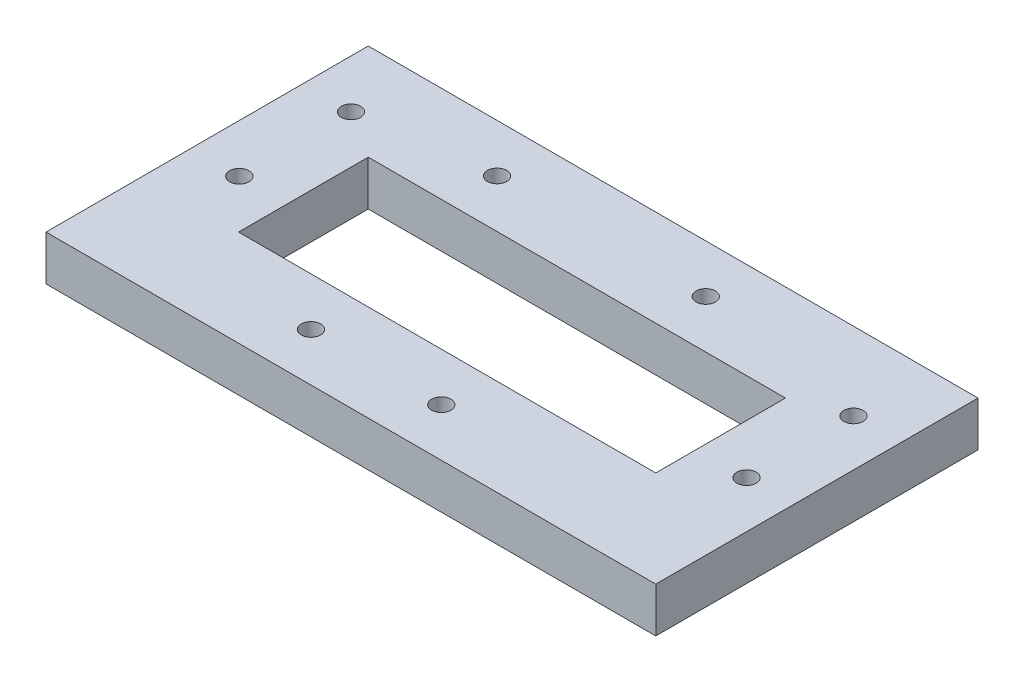
ISO-10303-21;
HEADER;
FILE_DESCRIPTION(('STEP AP214'),'2;1');
FILE_NAME('part.step','',(''),(''),'','','');
FILE_SCHEMA(('AUTOMOTIVE_DESIGN { 1 0 10303 214 1 1 1 1 }'));
ENDSEC;
DATA;
#1=APPLICATION_CONTEXT('core data for automotive mechanical design processes');
#2=APPLICATION_PROTOCOL_DEFINITION('international standard','automotive_design',2000,#1);
#3=PRODUCT_CONTEXT('',#1,'mechanical');
#4=PRODUCT('Part','Part','',(#3));
#5=PRODUCT_RELATED_PRODUCT_CATEGORY('part','',(#4));
#6=PRODUCT_DEFINITION_FORMATION('','',#4);
#7=PRODUCT_DEFINITION_CONTEXT('part definition',#1,'design');
#8=PRODUCT_DEFINITION('design','',#6,#7);
#9=PRODUCT_DEFINITION_SHAPE('','',#8);
#10=(LENGTH_UNIT() NAMED_UNIT(*) SI_UNIT(.MILLI.,.METRE.));
#11=(NAMED_UNIT(*) PLANE_ANGLE_UNIT() SI_UNIT($,.RADIAN.));
#12=(NAMED_UNIT(*) SI_UNIT($,.STERADIAN.) SOLID_ANGLE_UNIT());
#13=UNCERTAINTY_MEASURE_WITH_UNIT(LENGTH_MEASURE(1.E-05),#10,'distance_accuracy_value','');
#14=(GEOMETRIC_REPRESENTATION_CONTEXT(3) GLOBAL_UNCERTAINTY_ASSIGNED_CONTEXT((#13)) GLOBAL_UNIT_ASSIGNED_CONTEXT((#10,
#11,#12)) REPRESENTATION_CONTEXT('',''));
#15=CARTESIAN_POINT('',(0.,0.,0.));
#16=DIRECTION('',(0.,0.,1.));
#17=DIRECTION('',(1.,0.,0.));
#18=AXIS2_PLACEMENT_3D('',#15,#16,#17);
#19=CARTESIAN_POINT('',(0.,6.99999999999999,0.));
#20=DIRECTION('',(0.,-1.,0.));
#21=DIRECTION('',(0.,0.,-1.));
#22=AXIS2_PLACEMENT_3D('',#19,#20,#21);
#23=PLANE('',#22);
#24=DIRECTION('',(0.,0.,-1.));
#25=VECTOR('',#24,1.);
#26=CARTESIAN_POINT('',(47.499999996,6.99999999999999,25.10249996));
#27=LINE('',#26,#25);
#28=CARTESIAN_POINT('',(47.499999996,6.99999999999999,25.10249996));
#29=VERTEX_POINT('',#28);
#30=CARTESIAN_POINT('',(47.499999996,6.99999999999999,-25.10249996));
#31=VERTEX_POINT('',#30);
#32=EDGE_CURVE('E137',#29,#31,#27,.T.);
#33=ORIENTED_EDGE('',*,*,#32,.T.);
#34=DIRECTION('',(-1.,0.,0.));
#35=VECTOR('',#34,1.);
#36=CARTESIAN_POINT('',(-47.499999996,6.99999999999999,-25.10249996));
#37=LINE('',#36,#35);
#38=CARTESIAN_POINT('',(-47.499999996,6.99999999999999,-25.10249996));
#39=VERTEX_POINT('',#38);
#40=EDGE_CURVE('E140',#31,#39,#37,.T.);
#41=ORIENTED_EDGE('',*,*,#40,.T.);
#42=DIRECTION('',(0.,0.,1.));
#43=VECTOR('',#42,1.);
#44=CARTESIAN_POINT('',(-47.499999996,6.99999999999999,25.10249996));
#45=LINE('',#44,#43);
#46=CARTESIAN_POINT('',(-47.499999996,6.99999999999999,25.10249996));
#47=VERTEX_POINT('',#46);
#48=EDGE_CURVE('E143',#39,#47,#45,.T.);
#49=ORIENTED_EDGE('',*,*,#48,.T.);
#50=DIRECTION('',(1.,0.,0.));
#51=VECTOR('',#50,1.);
#52=CARTESIAN_POINT('',(-47.499999996,6.99999999999999,25.10249996));
#53=LINE('',#52,#51);
#54=EDGE_CURVE('E145',#47,#29,#53,.T.);
#55=ORIENTED_EDGE('',*,*,#54,.T.);
#56=EDGE_LOOP('',(#33,#41,#49,#55));
#57=FACE_BOUND('',#56,.T.);
#58=DIRECTION('',(0.,0.,-1.));
#59=VECTOR('',#58,1.);
#60=CARTESIAN_POINT('',(32.499999996,6.99999999999999,10.10249996));
#61=LINE('',#60,#59);
#62=CARTESIAN_POINT('',(32.499999996,6.99999999999999,10.10249996));
#63=VERTEX_POINT('',#62);
#64=CARTESIAN_POINT('',(32.499999996,6.99999999999999,-10.10249996));
#65=VERTEX_POINT('',#64);
#66=EDGE_CURVE('E98',#63,#65,#61,.T.);
#67=ORIENTED_EDGE('',*,*,#66,.F.);
#68=DIRECTION('',(1.,0.,0.));
#69=VECTOR('',#68,1.);
#70=CARTESIAN_POINT('',(-32.499999996,6.99999999999999,10.10249996));
#71=LINE('',#70,#69);
#72=CARTESIAN_POINT('',(-32.499999996,6.99999999999999,10.10249996));
#73=VERTEX_POINT('',#72);
#74=EDGE_CURVE('E121',#73,#63,#71,.T.);
#75=ORIENTED_EDGE('',*,*,#74,.F.);
#76=DIRECTION('',(0.,0.,1.));
#77=VECTOR('',#76,1.);
#78=CARTESIAN_POINT('',(-32.499999996,6.99999999999999,10.10249996));
#79=LINE('',#78,#77);
#80=CARTESIAN_POINT('',(-32.499999996,6.99999999999999,-10.10249996));
#81=VERTEX_POINT('',#80);
#82=EDGE_CURVE('E119',#81,#73,#79,.T.);
#83=ORIENTED_EDGE('',*,*,#82,.F.);
#84=DIRECTION('',(-1.,0.,0.));
#85=VECTOR('',#84,1.);
#86=CARTESIAN_POINT('',(-32.499999996,6.99999999999999,-10.10249996));
#87=LINE('',#86,#85);
#88=EDGE_CURVE('E106',#65,#81,#87,.T.);
#89=ORIENTED_EDGE('',*,*,#88,.F.);
#90=EDGE_LOOP('',(#67,#75,#83,#89));
#91=FACE_BOUND('',#90,.T.);
#92=CARTESIAN_POINT('',(-19.93576272361,6.99999999999999,-17.60249996));
#93=DIRECTION('',(0.,1.,0.));
#94=DIRECTION('',(0.,0.,1.));
#95=AXIS2_PLACEMENT_3D('',#92,#93,#94);
#96=CIRCLE('',#95,1.5);
#97=CARTESIAN_POINT('',(-19.93576272361,6.99999999999999,-16.10249996));
#98=VERTEX_POINT('',#97);
#99=EDGE_CURVE('E127',#98,#98,#96,.T.);
#100=ORIENTED_EDGE('',*,*,#99,.F.);
#101=EDGE_LOOP('',(#100));
#102=FACE_BOUND('',#101,.T.);
#103=CARTESIAN_POINT('',(12.5845762275947,6.99999999999999,-17.60249996));
#104=DIRECTION('',(0.,1.,0.));
#105=DIRECTION('',(0.,0.,1.));
#106=AXIS2_PLACEMENT_3D('',#103,#104,#105);
#107=CIRCLE('',#106,1.5);
#108=CARTESIAN_POINT('',(12.5845762275947,6.99999999999999,-16.10249996));
#109=VERTEX_POINT('',#108);
#110=EDGE_CURVE('E289',#109,#109,#107,.T.);
#111=ORIENTED_EDGE('',*,*,#110,.F.);
#112=EDGE_LOOP('',(#111));
#113=FACE_BOUND('',#112,.T.);
#114=CARTESIAN_POINT('',(-39.9706488970292,6.99999999999999,-14.8779420764374));
#115=DIRECTION('',(0.,1.,0.));
#116=DIRECTION('',(0.,0.,1.));
#117=AXIS2_PLACEMENT_3D('',#114,#115,#116);
#118=CIRCLE('',#117,1.5);
#119=CARTESIAN_POINT('',(-39.9706488970292,6.99999999999999,-13.3779420764374));
#120=VERTEX_POINT('',#119);
#121=EDGE_CURVE('E283',#120,#120,#118,.T.);
#122=ORIENTED_EDGE('',*,*,#121,.F.);
#123=EDGE_LOOP('',(#122));
#124=FACE_BOUND('',#123,.T.);
#125=CARTESIAN_POINT('',(-39.9706488970292,6.99999999999999,2.51774473684552));
#126=DIRECTION('',(0.,1.,0.));
#127=DIRECTION('',(0.,0.,1.));
#128=AXIS2_PLACEMENT_3D('',#125,#126,#127);
#129=CIRCLE('',#128,1.5);
#130=CARTESIAN_POINT('',(-39.9706488970292,6.99999999999999,4.01774473684552));
#131=VERTEX_POINT('',#130);
#132=EDGE_CURVE('E277',#131,#131,#129,.T.);
#133=ORIENTED_EDGE('',*,*,#132,.F.);
#134=EDGE_LOOP('',(#133));
#135=FACE_BOUND('',#134,.T.);
#136=CARTESIAN_POINT('',(40.2074773716267,6.99999999999999,-12.9906741674492));
#137=DIRECTION('',(0.,1.,0.));
#138=DIRECTION('',(0.,0.,1.));
#139=AXIS2_PLACEMENT_3D('',#136,#137,#138);
#140=CIRCLE('',#139,1.5);
#141=CARTESIAN_POINT('',(40.2074773716267,6.99999999999999,-11.4906741674492));
#142=VERTEX_POINT('',#141);
#143=EDGE_CURVE('E271',#142,#142,#140,.T.);
#144=ORIENTED_EDGE('',*,*,#143,.F.);
#145=EDGE_LOOP('',(#144));
#146=FACE_BOUND('',#145,.T.);
#147=CARTESIAN_POINT('',(40.2074773716267,6.99999999999999,3.666516507534));
#148=DIRECTION('',(0.,1.,0.));
#149=DIRECTION('',(0.,0.,1.));
#150=AXIS2_PLACEMENT_3D('',#147,#148,#149);
#151=CIRCLE('',#150,1.5);
#152=CARTESIAN_POINT('',(40.2074773716267,6.99999999999999,5.16651650753401));
#153=VERTEX_POINT('',#152);
#154=EDGE_CURVE('E265',#153,#153,#151,.T.);
#155=ORIENTED_EDGE('',*,*,#154,.F.);
#156=EDGE_LOOP('',(#155));
#157=FACE_BOUND('',#156,.T.);
#158=CARTESIAN_POINT('',(-13.7160544382587,6.99999999999999,17.60249996));
#159=DIRECTION('',(0.,1.,0.));
#160=DIRECTION('',(0.,0.,1.));
#161=AXIS2_PLACEMENT_3D('',#158,#159,#160);
#162=CIRCLE('',#161,1.5);
#163=CARTESIAN_POINT('',(-13.7160544382587,6.99999999999999,19.10249996));
#164=VERTEX_POINT('',#163);
#165=EDGE_CURVE('E259',#164,#164,#162,.T.);
#166=ORIENTED_EDGE('',*,*,#165,.F.);
#167=EDGE_LOOP('',(#166));
#168=FACE_BOUND('',#167,.T.);
#169=CARTESIAN_POINT('',(6.58063012474729,6.99999999999999,17.60249996));
#170=DIRECTION('',(0.,1.,0.));
#171=DIRECTION('',(0.,0.,1.));
#172=AXIS2_PLACEMENT_3D('',#169,#170,#171);
#173=CIRCLE('',#172,1.5);
#174=CARTESIAN_POINT('',(6.58063012474729,6.99999999999999,19.10249996));
#175=VERTEX_POINT('',#174);
#176=EDGE_CURVE('E250',#175,#175,#173,.T.);
#177=ORIENTED_EDGE('',*,*,#176,.F.);
#178=EDGE_LOOP('',(#177));
#179=FACE_BOUND('',#178,.T.);
#180=ADVANCED_FACE('F33',(#57,#91,#102,#113,#124,#135,#146,#157,#168,#179),#23,.F.);
#181=CARTESIAN_POINT('',(0.,0.,0.));
#182=DIRECTION('',(0.,-1.,0.));
#183=DIRECTION('',(0.,0.,-1.));
#184=AXIS2_PLACEMENT_3D('',#181,#182,#183);
#185=PLANE('',#184);
#186=CARTESIAN_POINT('',(-13.7160544382587,0.,17.60249996));
#187=DIRECTION('',(0.,1.,0.));
#188=DIRECTION('',(0.,0.,1.));
#189=AXIS2_PLACEMENT_3D('',#186,#187,#188);
#190=CIRCLE('',#189,1.5);
#191=CARTESIAN_POINT('',(-13.7160544382587,0.,19.10249996));
#192=VERTEX_POINT('',#191);
#193=EDGE_CURVE('E256',#192,#192,#190,.T.);
#194=ORIENTED_EDGE('',*,*,#193,.T.);
#195=EDGE_LOOP('',(#194));
#196=FACE_BOUND('',#195,.T.);
#197=CARTESIAN_POINT('',(40.2074773716267,0.,-12.9906741674492));
#198=DIRECTION('',(0.,1.,0.));
#199=DIRECTION('',(0.,0.,1.));
#200=AXIS2_PLACEMENT_3D('',#197,#198,#199);
#201=CIRCLE('',#200,1.5);
#202=CARTESIAN_POINT('',(40.2074773716267,0.,-11.4906741674492));
#203=VERTEX_POINT('',#202);
#204=EDGE_CURVE('E268',#203,#203,#201,.T.);
#205=ORIENTED_EDGE('',*,*,#204,.T.);
#206=EDGE_LOOP('',(#205));
#207=FACE_BOUND('',#206,.T.);
#208=CARTESIAN_POINT('',(-39.9706488970292,0.,-14.8779420764374));
#209=DIRECTION('',(0.,1.,0.));
#210=DIRECTION('',(0.,0.,1.));
#211=AXIS2_PLACEMENT_3D('',#208,#209,#210);
#212=CIRCLE('',#211,1.5);
#213=CARTESIAN_POINT('',(-39.9706488970292,0.,-13.3779420764374));
#214=VERTEX_POINT('',#213);
#215=EDGE_CURVE('E280',#214,#214,#212,.T.);
#216=ORIENTED_EDGE('',*,*,#215,.T.);
#217=EDGE_LOOP('',(#216));
#218=FACE_BOUND('',#217,.T.);
#219=CARTESIAN_POINT('',(-19.93576272361,0.,-17.60249996));
#220=DIRECTION('',(0.,1.,0.));
#221=DIRECTION('',(0.,0.,1.));
#222=AXIS2_PLACEMENT_3D('',#219,#220,#221);
#223=CIRCLE('',#222,1.5);
#224=CARTESIAN_POINT('',(-19.93576272361,0.,-16.10249996));
#225=VERTEX_POINT('',#224);
#226=EDGE_CURVE('E292',#225,#225,#223,.T.);
#227=ORIENTED_EDGE('',*,*,#226,.T.);
#228=EDGE_LOOP('',(#227));
#229=FACE_BOUND('',#228,.T.);
#230=DIRECTION('',(0.,0.,-1.));
#231=VECTOR('',#230,1.);
#232=CARTESIAN_POINT('',(47.499999996,0.,25.10249996));
#233=LINE('',#232,#231);
#234=CARTESIAN_POINT('',(47.499999996,0.,25.10249996));
#235=VERTEX_POINT('',#234);
#236=CARTESIAN_POINT('',(47.499999996,0.,-25.10249996));
#237=VERTEX_POINT('',#236);
#238=EDGE_CURVE('E114',#235,#237,#233,.T.);
#239=ORIENTED_EDGE('',*,*,#238,.F.);
#240=DIRECTION('',(1.,0.,0.));
#241=VECTOR('',#240,1.);
#242=CARTESIAN_POINT('',(-47.499999996,0.,25.10249996));
#243=LINE('',#242,#241);
#244=CARTESIAN_POINT('',(-47.499999996,0.,25.10249996));
#245=VERTEX_POINT('',#244);
#246=EDGE_CURVE('E141',#245,#235,#243,.T.);
#247=ORIENTED_EDGE('',*,*,#246,.F.);
#248=DIRECTION('',(0.,0.,1.));
#249=VECTOR('',#248,1.);
#250=CARTESIAN_POINT('',(-47.499999996,0.,25.10249996));
#251=LINE('',#250,#249);
#252=CARTESIAN_POINT('',(-47.499999996,0.,-25.10249996));
#253=VERTEX_POINT('',#252);
#254=EDGE_CURVE('E152',#253,#245,#251,.T.);
#255=ORIENTED_EDGE('',*,*,#254,.F.);
#256=DIRECTION('',(-1.,0.,0.));
#257=VECTOR('',#256,1.);
#258=CARTESIAN_POINT('',(-47.499999996,0.,-25.10249996));
#259=LINE('',#258,#257);
#260=EDGE_CURVE('E150',#237,#253,#259,.T.);
#261=ORIENTED_EDGE('',*,*,#260,.F.);
#262=EDGE_LOOP('',(#239,#247,#255,#261));
#263=FACE_BOUND('',#262,.T.);
#264=DIRECTION('',(1.,0.,0.));
#265=VECTOR('',#264,1.);
#266=CARTESIAN_POINT('',(-32.499999996,0.,10.10249996));
#267=LINE('',#266,#265);
#268=CARTESIAN_POINT('',(-32.499999996,0.,10.10249996));
#269=VERTEX_POINT('',#268);
#270=CARTESIAN_POINT('',(32.499999996,0.,10.10249996));
#271=VERTEX_POINT('',#270);
#272=EDGE_CURVE('E107',#269,#271,#267,.T.);
#273=ORIENTED_EDGE('',*,*,#272,.T.);
#274=DIRECTION('',(0.,0.,-1.));
#275=VECTOR('',#274,1.);
#276=CARTESIAN_POINT('',(32.499999996,0.,10.10249996));
#277=LINE('',#276,#275);
#278=CARTESIAN_POINT('',(32.499999996,0.,-10.10249996));
#279=VERTEX_POINT('',#278);
#280=EDGE_CURVE('E56',#271,#279,#277,.T.);
#281=ORIENTED_EDGE('',*,*,#280,.T.);
#282=DIRECTION('',(-1.,0.,0.));
#283=VECTOR('',#282,1.);
#284=CARTESIAN_POINT('',(-32.499999996,0.,-10.10249996));
#285=LINE('',#284,#283);
#286=CARTESIAN_POINT('',(-32.499999996,0.,-10.10249996));
#287=VERTEX_POINT('',#286);
#288=EDGE_CURVE('E113',#279,#287,#285,.T.);
#289=ORIENTED_EDGE('',*,*,#288,.T.);
#290=DIRECTION('',(0.,0.,1.));
#291=VECTOR('',#290,1.);
#292=CARTESIAN_POINT('',(-32.499999996,0.,10.10249996));
#293=LINE('',#292,#291);
#294=EDGE_CURVE('E129',#287,#269,#293,.T.);
#295=ORIENTED_EDGE('',*,*,#294,.T.);
#296=EDGE_LOOP('',(#273,#281,#289,#295));
#297=FACE_BOUND('',#296,.T.);
#298=CARTESIAN_POINT('',(12.5845762275947,0.,-17.60249996));
#299=DIRECTION('',(0.,1.,0.));
#300=DIRECTION('',(0.,0.,1.));
#301=AXIS2_PLACEMENT_3D('',#298,#299,#300);
#302=CIRCLE('',#301,1.5);
#303=CARTESIAN_POINT('',(12.5845762275947,0.,-16.10249996));
#304=VERTEX_POINT('',#303);
#305=EDGE_CURVE('E286',#304,#304,#302,.T.);
#306=ORIENTED_EDGE('',*,*,#305,.T.);
#307=EDGE_LOOP('',(#306));
#308=FACE_BOUND('',#307,.T.);
#309=CARTESIAN_POINT('',(-39.9706488970292,0.,2.51774473684552));
#310=DIRECTION('',(0.,1.,0.));
#311=DIRECTION('',(0.,0.,1.));
#312=AXIS2_PLACEMENT_3D('',#309,#310,#311);
#313=CIRCLE('',#312,1.5);
#314=CARTESIAN_POINT('',(-39.9706488970292,0.,4.01774473684552));
#315=VERTEX_POINT('',#314);
#316=EDGE_CURVE('E274',#315,#315,#313,.T.);
#317=ORIENTED_EDGE('',*,*,#316,.T.);
#318=EDGE_LOOP('',(#317));
#319=FACE_BOUND('',#318,.T.);
#320=CARTESIAN_POINT('',(40.2074773716267,0.,3.666516507534));
#321=DIRECTION('',(0.,1.,0.));
#322=DIRECTION('',(0.,0.,1.));
#323=AXIS2_PLACEMENT_3D('',#320,#321,#322);
#324=CIRCLE('',#323,1.5);
#325=CARTESIAN_POINT('',(40.2074773716267,0.,5.16651650753401));
#326=VERTEX_POINT('',#325);
#327=EDGE_CURVE('E262',#326,#326,#324,.T.);
#328=ORIENTED_EDGE('',*,*,#327,.T.);
#329=EDGE_LOOP('',(#328));
#330=FACE_BOUND('',#329,.T.);
#331=CARTESIAN_POINT('',(6.58063012474729,0.,17.60249996));
#332=DIRECTION('',(0.,1.,0.));
#333=DIRECTION('',(0.,0.,1.));
#334=AXIS2_PLACEMENT_3D('',#331,#332,#333);
#335=CIRCLE('',#334,1.5);
#336=CARTESIAN_POINT('',(6.58063012474729,0.,19.10249996));
#337=VERTEX_POINT('',#336);
#338=EDGE_CURVE('E253',#337,#337,#335,.T.);
#339=ORIENTED_EDGE('',*,*,#338,.T.);
#340=EDGE_LOOP('',(#339));
#341=FACE_BOUND('',#340,.T.);
#342=ADVANCED_FACE('F170',(#196,#207,#218,#229,#263,#297,#308,#319,#330,#341),#185,.T.);
#343=CARTESIAN_POINT('',(47.499999996,6.99999999999999,25.10249996));
#344=DIRECTION('',(-1.,0.,0.));
#345=DIRECTION('',(0.,0.,1.));
#346=AXIS2_PLACEMENT_3D('',#343,#344,#345);
#347=PLANE('',#346);
#348=ORIENTED_EDGE('',*,*,#238,.T.);
#349=DIRECTION('',(0.,-1.,0.));
#350=VECTOR('',#349,1.);
#351=CARTESIAN_POINT('',(47.499999996,6.99999999999999,-25.10249996));
#352=LINE('',#351,#350);
#353=EDGE_CURVE('E11',#31,#237,#352,.T.);
#354=ORIENTED_EDGE('',*,*,#353,.F.);
#355=ORIENTED_EDGE('',*,*,#32,.F.);
#356=DIRECTION('',(0.,-1.,0.));
#357=VECTOR('',#356,1.);
#358=CARTESIAN_POINT('',(47.499999996,6.99999999999999,25.10249996));
#359=LINE('',#358,#357);
#360=EDGE_CURVE('E147',#29,#235,#359,.T.);
#361=ORIENTED_EDGE('',*,*,#360,.T.);
#362=EDGE_LOOP('',(#348,#354,#355,#361));
#363=FACE_BOUND('',#362,.T.);
#364=ADVANCED_FACE('F35',(#363),#347,.F.);
#365=CARTESIAN_POINT('',(-47.499999996,6.99999999999999,-25.10249996));
#366=DIRECTION('',(0.,0.,1.));
#367=DIRECTION('',(1.,0.,0.));
#368=AXIS2_PLACEMENT_3D('',#365,#366,#367);
#369=PLANE('',#368);
#370=ORIENTED_EDGE('',*,*,#260,.T.);
#371=DIRECTION('',(0.,-1.,0.));
#372=VECTOR('',#371,1.);
#373=CARTESIAN_POINT('',(-47.499999996,6.99999999999999,-25.10249996));
#374=LINE('',#373,#372);
#375=EDGE_CURVE('E41',#39,#253,#374,.T.);
#376=ORIENTED_EDGE('',*,*,#375,.F.);
#377=ORIENTED_EDGE('',*,*,#40,.F.);
#378=ORIENTED_EDGE('',*,*,#353,.T.);
#379=EDGE_LOOP('',(#370,#376,#377,#378));
#380=FACE_BOUND('',#379,.T.);
#381=ADVANCED_FACE('F180',(#380),#369,.F.);
#382=CARTESIAN_POINT('',(-47.499999996,6.99999999999999,25.10249996));
#383=DIRECTION('',(1.,0.,0.));
#384=DIRECTION('',(0.,0.,-1.));
#385=AXIS2_PLACEMENT_3D('',#382,#383,#384);
#386=PLANE('',#385);
#387=ORIENTED_EDGE('',*,*,#254,.T.);
#388=DIRECTION('',(0.,-1.,0.));
#389=VECTOR('',#388,1.);
#390=CARTESIAN_POINT('',(-47.499999996,6.99999999999999,25.10249996));
#391=LINE('',#390,#389);
#392=EDGE_CURVE('E157',#47,#245,#391,.T.);
#393=ORIENTED_EDGE('',*,*,#392,.F.);
#394=ORIENTED_EDGE('',*,*,#48,.F.);
#395=ORIENTED_EDGE('',*,*,#375,.T.);
#396=EDGE_LOOP('',(#387,#393,#394,#395));
#397=FACE_BOUND('',#396,.T.);
#398=ADVANCED_FACE('F164',(#397),#386,.F.);
#399=CARTESIAN_POINT('',(-47.499999996,6.99999999999999,25.10249996));
#400=DIRECTION('',(0.,0.,-1.));
#401=DIRECTION('',(-1.,0.,0.));
#402=AXIS2_PLACEMENT_3D('',#399,#400,#401);
#403=PLANE('',#402);
#404=ORIENTED_EDGE('',*,*,#246,.T.);
#405=ORIENTED_EDGE('',*,*,#360,.F.);
#406=ORIENTED_EDGE('',*,*,#54,.F.);
#407=ORIENTED_EDGE('',*,*,#392,.T.);
#408=EDGE_LOOP('',(#404,#405,#406,#407));
#409=FACE_BOUND('',#408,.T.);
#410=ADVANCED_FACE('F174',(#409),#403,.F.);
#411=CARTESIAN_POINT('',(32.499999996,6.99999999999999,10.10249996));
#412=DIRECTION('',(-1.,0.,0.));
#413=DIRECTION('',(0.,0.,1.));
#414=AXIS2_PLACEMENT_3D('',#411,#412,#413);
#415=PLANE('',#414);
#416=ORIENTED_EDGE('',*,*,#280,.F.);
#417=DIRECTION('',(0.,-1.,0.));
#418=VECTOR('',#417,1.);
#419=CARTESIAN_POINT('',(32.499999996,6.99999999999999,10.10249996));
#420=LINE('',#419,#418);
#421=EDGE_CURVE('E102',#63,#271,#420,.T.);
#422=ORIENTED_EDGE('',*,*,#421,.F.);
#423=ORIENTED_EDGE('',*,*,#66,.T.);
#424=DIRECTION('',(0.,-1.,0.));
#425=VECTOR('',#424,1.);
#426=CARTESIAN_POINT('',(32.499999996,6.99999999999999,-10.10249996));
#427=LINE('',#426,#425);
#428=EDGE_CURVE('E101',#65,#279,#427,.T.);
#429=ORIENTED_EDGE('',*,*,#428,.T.);
#430=EDGE_LOOP('',(#416,#422,#423,#429));
#431=FACE_BOUND('',#430,.T.);
#432=ADVANCED_FACE('F100',(#431),#415,.T.);
#433=CARTESIAN_POINT('',(-32.499999996,6.99999999999999,-10.10249996));
#434=DIRECTION('',(0.,0.,1.));
#435=DIRECTION('',(1.,0.,0.));
#436=AXIS2_PLACEMENT_3D('',#433,#434,#435);
#437=PLANE('',#436);
#438=ORIENTED_EDGE('',*,*,#288,.F.);
#439=ORIENTED_EDGE('',*,*,#428,.F.);
#440=ORIENTED_EDGE('',*,*,#88,.T.);
#441=DIRECTION('',(0.,-1.,0.));
#442=VECTOR('',#441,1.);
#443=CARTESIAN_POINT('',(-32.499999996,6.99999999999999,-10.10249996));
#444=LINE('',#443,#442);
#445=EDGE_CURVE('E115',#81,#287,#444,.T.);
#446=ORIENTED_EDGE('',*,*,#445,.T.);
#447=EDGE_LOOP('',(#438,#439,#440,#446));
#448=FACE_BOUND('',#447,.T.);
#449=ADVANCED_FACE('F110',(#448),#437,.T.);
#450=CARTESIAN_POINT('',(-32.499999996,6.99999999999999,10.10249996));
#451=DIRECTION('',(1.,0.,0.));
#452=DIRECTION('',(0.,0.,-1.));
#453=AXIS2_PLACEMENT_3D('',#450,#451,#452);
#454=PLANE('',#453);
#455=ORIENTED_EDGE('',*,*,#294,.F.);
#456=ORIENTED_EDGE('',*,*,#445,.F.);
#457=ORIENTED_EDGE('',*,*,#82,.T.);
#458=DIRECTION('',(0.,-1.,0.));
#459=VECTOR('',#458,1.);
#460=CARTESIAN_POINT('',(-32.499999996,6.99999999999999,10.10249996));
#461=LINE('',#460,#459);
#462=EDGE_CURVE('E48',#73,#269,#461,.T.);
#463=ORIENTED_EDGE('',*,*,#462,.T.);
#464=EDGE_LOOP('',(#455,#456,#457,#463));
#465=FACE_BOUND('',#464,.T.);
#466=ADVANCED_FACE('F204',(#465),#454,.T.);
#467=CARTESIAN_POINT('',(-32.499999996,6.99999999999999,10.10249996));
#468=DIRECTION('',(0.,0.,-1.));
#469=DIRECTION('',(-1.,0.,0.));
#470=AXIS2_PLACEMENT_3D('',#467,#468,#469);
#471=PLANE('',#470);
#472=ORIENTED_EDGE('',*,*,#272,.F.);
#473=ORIENTED_EDGE('',*,*,#462,.F.);
#474=ORIENTED_EDGE('',*,*,#74,.T.);
#475=ORIENTED_EDGE('',*,*,#421,.T.);
#476=EDGE_LOOP('',(#472,#473,#474,#475));
#477=FACE_BOUND('',#476,.T.);
#478=ADVANCED_FACE('F208',(#477),#471,.T.);
#479=CARTESIAN_POINT('',(-19.93576272361,6.99999999999999,-17.60249996));
#480=DIRECTION('',(0.,-1.,0.));
#481=DIRECTION('',(0.,0.,-1.));
#482=AXIS2_PLACEMENT_3D('',#479,#480,#481);
#483=CYLINDRICAL_SURFACE('',#482,1.5);
#484=ORIENTED_EDGE('',*,*,#99,.T.);
#485=EDGE_LOOP('',(#484));
#486=FACE_BOUND('',#485,.T.);
#487=ORIENTED_EDGE('',*,*,#226,.F.);
#488=EDGE_LOOP('',(#487));
#489=FACE_BOUND('',#488,.T.);
#490=ADVANCED_FACE('F214',(#486,#489),#483,.F.);
#491=CARTESIAN_POINT('',(12.5845762275947,6.99999999999999,-17.60249996));
#492=DIRECTION('',(0.,-1.,0.));
#493=DIRECTION('',(0.,0.,-1.));
#494=AXIS2_PLACEMENT_3D('',#491,#492,#493);
#495=CYLINDRICAL_SURFACE('',#494,1.5);
#496=ORIENTED_EDGE('',*,*,#110,.T.);
#497=EDGE_LOOP('',(#496));
#498=FACE_BOUND('',#497,.T.);
#499=ORIENTED_EDGE('',*,*,#305,.F.);
#500=EDGE_LOOP('',(#499));
#501=FACE_BOUND('',#500,.T.);
#502=ADVANCED_FACE('F217',(#498,#501),#495,.F.);
#503=CARTESIAN_POINT('',(-39.9706488970292,6.99999999999999,-14.8779420764374));
#504=DIRECTION('',(0.,-1.,0.));
#505=DIRECTION('',(0.,0.,-1.));
#506=AXIS2_PLACEMENT_3D('',#503,#504,#505);
#507=CYLINDRICAL_SURFACE('',#506,1.5);
#508=ORIENTED_EDGE('',*,*,#121,.T.);
#509=EDGE_LOOP('',(#508));
#510=FACE_BOUND('',#509,.T.);
#511=ORIENTED_EDGE('',*,*,#215,.F.);
#512=EDGE_LOOP('',(#511));
#513=FACE_BOUND('',#512,.T.);
#514=ADVANCED_FACE('F221',(#510,#513),#507,.F.);
#515=CARTESIAN_POINT('',(-39.9706488970292,6.99999999999999,2.51774473684552));
#516=DIRECTION('',(0.,-1.,0.));
#517=DIRECTION('',(0.,0.,-1.));
#518=AXIS2_PLACEMENT_3D('',#515,#516,#517);
#519=CYLINDRICAL_SURFACE('',#518,1.5);
#520=ORIENTED_EDGE('',*,*,#132,.T.);
#521=EDGE_LOOP('',(#520));
#522=FACE_BOUND('',#521,.T.);
#523=ORIENTED_EDGE('',*,*,#316,.F.);
#524=EDGE_LOOP('',(#523));
#525=FACE_BOUND('',#524,.T.);
#526=ADVANCED_FACE('F225',(#522,#525),#519,.F.);
#527=CARTESIAN_POINT('',(40.2074773716267,6.99999999999999,-12.9906741674492));
#528=DIRECTION('',(0.,-1.,0.));
#529=DIRECTION('',(0.,0.,-1.));
#530=AXIS2_PLACEMENT_3D('',#527,#528,#529);
#531=CYLINDRICAL_SURFACE('',#530,1.5);
#532=ORIENTED_EDGE('',*,*,#143,.T.);
#533=EDGE_LOOP('',(#532));
#534=FACE_BOUND('',#533,.T.);
#535=ORIENTED_EDGE('',*,*,#204,.F.);
#536=EDGE_LOOP('',(#535));
#537=FACE_BOUND('',#536,.T.);
#538=ADVANCED_FACE('F229',(#534,#537),#531,.F.);
#539=CARTESIAN_POINT('',(40.2074773716267,6.99999999999999,3.666516507534));
#540=DIRECTION('',(0.,-1.,0.));
#541=DIRECTION('',(0.,0.,-1.));
#542=AXIS2_PLACEMENT_3D('',#539,#540,#541);
#543=CYLINDRICAL_SURFACE('',#542,1.5);
#544=ORIENTED_EDGE('',*,*,#154,.T.);
#545=EDGE_LOOP('',(#544));
#546=FACE_BOUND('',#545,.T.);
#547=ORIENTED_EDGE('',*,*,#327,.F.);
#548=EDGE_LOOP('',(#547));
#549=FACE_BOUND('',#548,.T.);
#550=ADVANCED_FACE('F233',(#546,#549),#543,.F.);
#551=CARTESIAN_POINT('',(-13.7160544382587,6.99999999999999,17.60249996));
#552=DIRECTION('',(0.,-1.,0.));
#553=DIRECTION('',(0.,0.,-1.));
#554=AXIS2_PLACEMENT_3D('',#551,#552,#553);
#555=CYLINDRICAL_SURFACE('',#554,1.5);
#556=ORIENTED_EDGE('',*,*,#165,.T.);
#557=EDGE_LOOP('',(#556));
#558=FACE_BOUND('',#557,.T.);
#559=ORIENTED_EDGE('',*,*,#193,.F.);
#560=EDGE_LOOP('',(#559));
#561=FACE_BOUND('',#560,.T.);
#562=ADVANCED_FACE('F237',(#558,#561),#555,.F.);
#563=CARTESIAN_POINT('',(6.58063012474729,6.99999999999999,17.60249996));
#564=DIRECTION('',(0.,-1.,0.));
#565=DIRECTION('',(0.,0.,-1.));
#566=AXIS2_PLACEMENT_3D('',#563,#564,#565);
#567=CYLINDRICAL_SURFACE('',#566,1.5);
#568=ORIENTED_EDGE('',*,*,#176,.T.);
#569=EDGE_LOOP('',(#568));
#570=FACE_BOUND('',#569,.T.);
#571=ORIENTED_EDGE('',*,*,#338,.F.);
#572=EDGE_LOOP('',(#571));
#573=FACE_BOUND('',#572,.T.);
#574=ADVANCED_FACE('F241',(#570,#573),#567,.F.);
#575=CLOSED_SHELL('',(#180,#342,#364,#381,#398,#410,#432,#449,#466,#478,#490,#502,#514,#526,
#538,#550,#562,#574));
#576=MANIFOLD_SOLID_BREP('B2',#575);
#577=ADVANCED_BREP_SHAPE_REPRESENTATION('',(#18,#576),#14);
#578=SHAPE_DEFINITION_REPRESENTATION(#9,#577);
ENDSEC;
END-ISO-10303-21;
